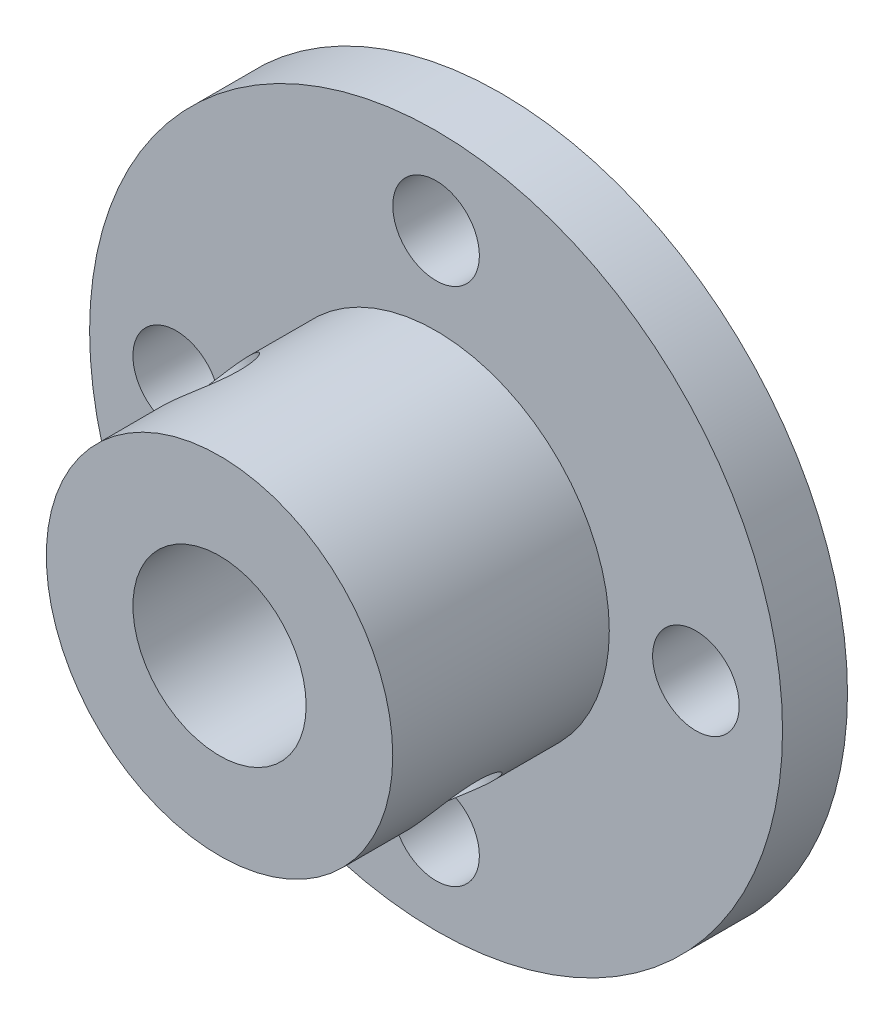
ISO-10303-21;
HEADER;
FILE_DESCRIPTION(('STEP AP214'),'2;1');
FILE_NAME('part.step','',(''),(''),'','','');
FILE_SCHEMA(('AUTOMOTIVE_DESIGN { 1 0 10303 214 1 1 1 1 }'));
ENDSEC;
DATA;
#1=APPLICATION_CONTEXT('core data for automotive mechanical design processes');
#2=APPLICATION_PROTOCOL_DEFINITION('international standard','automotive_design',2000,#1);
#3=PRODUCT_CONTEXT('',#1,'mechanical');
#4=PRODUCT('Part','Part','',(#3));
#5=PRODUCT_RELATED_PRODUCT_CATEGORY('part','',(#4));
#6=PRODUCT_DEFINITION_FORMATION('','',#4);
#7=PRODUCT_DEFINITION_CONTEXT('part definition',#1,'design');
#8=PRODUCT_DEFINITION('design','',#6,#7);
#9=PRODUCT_DEFINITION_SHAPE('','',#8);
#10=(LENGTH_UNIT() NAMED_UNIT(*) SI_UNIT(.MILLI.,.METRE.));
#11=(NAMED_UNIT(*) PLANE_ANGLE_UNIT() SI_UNIT($,.RADIAN.));
#12=(NAMED_UNIT(*) SI_UNIT($,.STERADIAN.) SOLID_ANGLE_UNIT());
#13=UNCERTAINTY_MEASURE_WITH_UNIT(LENGTH_MEASURE(1.E-05),#10,'distance_accuracy_value','');
#14=(GEOMETRIC_REPRESENTATION_CONTEXT(3) GLOBAL_UNCERTAINTY_ASSIGNED_CONTEXT((#13)) GLOBAL_UNIT_ASSIGNED_CONTEXT((#10,
#11,#12)) REPRESENTATION_CONTEXT('',''));
#15=CARTESIAN_POINT('',(0.,0.,0.));
#16=DIRECTION('',(0.,0.,1.));
#17=DIRECTION('',(1.,0.,0.));
#18=AXIS2_PLACEMENT_3D('',#15,#16,#17);
#19=CARTESIAN_POINT('',(0.,0.,3.));
#20=DIRECTION('',(0.,0.,-1.));
#21=DIRECTION('',(-1.,0.,0.));
#22=AXIS2_PLACEMENT_3D('',#19,#20,#21);
#23=CYLINDRICAL_SURFACE('',#22,16.);
#24=CARTESIAN_POINT('',(0.,0.,3.));
#25=DIRECTION('',(0.,0.,1.));
#26=DIRECTION('',(1.,0.,0.));
#27=AXIS2_PLACEMENT_3D('',#24,#25,#26);
#28=CIRCLE('',#27,16.);
#29=CARTESIAN_POINT('',(16.,0.,3.));
#30=VERTEX_POINT('',#29);
#31=EDGE_CURVE('E46',#30,#30,#28,.T.);
#32=ORIENTED_EDGE('',*,*,#31,.F.);
#33=EDGE_LOOP('',(#32));
#34=FACE_BOUND('',#33,.T.);
#35=CARTESIAN_POINT('',(0.,0.,0.));
#36=DIRECTION('',(0.,0.,1.));
#37=DIRECTION('',(1.,0.,0.));
#38=AXIS2_PLACEMENT_3D('',#35,#36,#37);
#39=CIRCLE('',#38,16.);
#40=CARTESIAN_POINT('',(16.,0.,0.));
#41=VERTEX_POINT('',#40);
#42=EDGE_CURVE('E51',#41,#41,#39,.T.);
#43=ORIENTED_EDGE('',*,*,#42,.T.);
#44=EDGE_LOOP('',(#43));
#45=FACE_BOUND('',#44,.T.);
#46=ADVANCED_FACE('F34',(#34,#45),#23,.T.);
#47=CARTESIAN_POINT('',(0.,0.,3.));
#48=DIRECTION('',(0.,0.,1.));
#49=DIRECTION('',(1.,0.,0.));
#50=AXIS2_PLACEMENT_3D('',#47,#48,#49);
#51=PLANE('',#50);
#52=CARTESIAN_POINT('',(-12.,0.,3.));
#53=DIRECTION('',(0.,0.,1.));
#54=DIRECTION('',(1.,0.,0.));
#55=AXIS2_PLACEMENT_3D('',#52,#53,#54);
#56=CIRCLE('',#55,2.);
#57=CARTESIAN_POINT('',(-10.,0.,3.));
#58=VERTEX_POINT('',#57);
#59=EDGE_CURVE('E92',#58,#58,#56,.T.);
#60=ORIENTED_EDGE('',*,*,#59,.F.);
#61=EDGE_LOOP('',(#60));
#62=FACE_BOUND('',#61,.T.);
#63=CARTESIAN_POINT('',(0.,12.,3.));
#64=DIRECTION('',(0.,0.,1.));
#65=DIRECTION('',(1.,0.,0.));
#66=AXIS2_PLACEMENT_3D('',#63,#64,#65);
#67=CIRCLE('',#66,2.);
#68=CARTESIAN_POINT('',(2.00000000000004,12.,3.));
#69=VERTEX_POINT('',#68);
#70=EDGE_CURVE('E100',#69,#69,#67,.T.);
#71=ORIENTED_EDGE('',*,*,#70,.F.);
#72=EDGE_LOOP('',(#71));
#73=FACE_BOUND('',#72,.T.);
#74=CARTESIAN_POINT('',(12.,0.,3.));
#75=DIRECTION('',(0.,0.,1.));
#76=DIRECTION('',(1.,0.,0.));
#77=AXIS2_PLACEMENT_3D('',#74,#75,#76);
#78=CIRCLE('',#77,2.);
#79=CARTESIAN_POINT('',(14.,0.,3.));
#80=VERTEX_POINT('',#79);
#81=EDGE_CURVE('E106',#80,#80,#78,.T.);
#82=ORIENTED_EDGE('',*,*,#81,.F.);
#83=EDGE_LOOP('',(#82));
#84=FACE_BOUND('',#83,.T.);
#85=CARTESIAN_POINT('',(-1.25693328198353E-13,-12.,3.));
#86=DIRECTION('',(0.,0.,1.));
#87=DIRECTION('',(1.,0.,0.));
#88=AXIS2_PLACEMENT_3D('',#85,#86,#87);
#89=CIRCLE('',#88,2.);
#90=CARTESIAN_POINT('',(1.99999999999987,-12.,3.));
#91=VERTEX_POINT('',#90);
#92=EDGE_CURVE('E112',#91,#91,#89,.T.);
#93=ORIENTED_EDGE('',*,*,#92,.F.);
#94=EDGE_LOOP('',(#93));
#95=FACE_BOUND('',#94,.T.);
#96=CARTESIAN_POINT('',(0.,0.,3.));
#97=DIRECTION('',(0.,0.,1.));
#98=DIRECTION('',(1.,0.,0.));
#99=AXIS2_PLACEMENT_3D('',#96,#97,#98);
#100=CIRCLE('',#99,8.);
#101=CARTESIAN_POINT('',(8.,0.,3.));
#102=VERTEX_POINT('',#101);
#103=EDGE_CURVE('E10',#102,#102,#100,.T.);
#104=ORIENTED_EDGE('',*,*,#103,.F.);
#105=EDGE_LOOP('',(#104));
#106=FACE_BOUND('',#105,.T.);
#107=ORIENTED_EDGE('',*,*,#31,.T.);
#108=EDGE_LOOP('',(#107));
#109=FACE_BOUND('',#108,.T.);
#110=ADVANCED_FACE('F137',(#62,#73,#84,#95,#106,#109),#51,.T.);
#111=CARTESIAN_POINT('',(0.,0.,0.));
#112=DIRECTION('',(0.,0.,1.));
#113=DIRECTION('',(1.,0.,0.));
#114=AXIS2_PLACEMENT_3D('',#111,#112,#113);
#115=PLANE('',#114);
#116=CARTESIAN_POINT('',(-12.,0.,0.));
#117=DIRECTION('',(0.,0.,1.));
#118=DIRECTION('',(1.,0.,0.));
#119=AXIS2_PLACEMENT_3D('',#116,#117,#118);
#120=CIRCLE('',#119,2.);
#121=CARTESIAN_POINT('',(-10.,0.,0.));
#122=VERTEX_POINT('',#121);
#123=EDGE_CURVE('E95',#122,#122,#120,.F.);
#124=ORIENTED_EDGE('',*,*,#123,.F.);
#125=EDGE_LOOP('',(#124));
#126=FACE_BOUND('',#125,.T.);
#127=CARTESIAN_POINT('',(0.,12.,0.));
#128=DIRECTION('',(0.,0.,1.));
#129=DIRECTION('',(1.,0.,0.));
#130=AXIS2_PLACEMENT_3D('',#127,#128,#129);
#131=CIRCLE('',#130,2.);
#132=CARTESIAN_POINT('',(2.00000000000004,12.,0.));
#133=VERTEX_POINT('',#132);
#134=EDGE_CURVE('E96',#133,#133,#131,.F.);
#135=ORIENTED_EDGE('',*,*,#134,.F.);
#136=EDGE_LOOP('',(#135));
#137=FACE_BOUND('',#136,.T.);
#138=CARTESIAN_POINT('',(12.,0.,0.));
#139=DIRECTION('',(0.,0.,1.));
#140=DIRECTION('',(1.,0.,0.));
#141=AXIS2_PLACEMENT_3D('',#138,#139,#140);
#142=CIRCLE('',#141,2.);
#143=CARTESIAN_POINT('',(14.,0.,0.));
#144=VERTEX_POINT('',#143);
#145=EDGE_CURVE('E103',#144,#144,#142,.F.);
#146=ORIENTED_EDGE('',*,*,#145,.F.);
#147=EDGE_LOOP('',(#146));
#148=FACE_BOUND('',#147,.T.);
#149=CARTESIAN_POINT('',(-1.25693328198353E-13,-12.,0.));
#150=DIRECTION('',(0.,0.,1.));
#151=DIRECTION('',(1.,0.,0.));
#152=AXIS2_PLACEMENT_3D('',#149,#150,#151);
#153=CIRCLE('',#152,2.);
#154=CARTESIAN_POINT('',(1.99999999999987,-12.,0.));
#155=VERTEX_POINT('',#154);
#156=EDGE_CURVE('E109',#155,#155,#153,.F.);
#157=ORIENTED_EDGE('',*,*,#156,.F.);
#158=EDGE_LOOP('',(#157));
#159=FACE_BOUND('',#158,.T.);
#160=CARTESIAN_POINT('',(0.,0.,0.));
#161=DIRECTION('',(0.,0.,1.));
#162=DIRECTION('',(1.,0.,0.));
#163=AXIS2_PLACEMENT_3D('',#160,#161,#162);
#164=CIRCLE('',#163,4.);
#165=CARTESIAN_POINT('',(4.,0.,0.));
#166=VERTEX_POINT('',#165);
#167=EDGE_CURVE('E118',#166,#166,#164,.F.);
#168=ORIENTED_EDGE('',*,*,#167,.F.);
#169=EDGE_LOOP('',(#168));
#170=FACE_BOUND('',#169,.T.);
#171=ORIENTED_EDGE('',*,*,#42,.F.);
#172=EDGE_LOOP('',(#171));
#173=FACE_BOUND('',#172,.T.);
#174=ADVANCED_FACE('F129',(#126,#137,#148,#159,#170,#173),#115,.F.);
#175=CARTESIAN_POINT('',(0.,0.,13.));
#176=DIRECTION('',(0.,0.,-1.));
#177=DIRECTION('',(-1.,0.,0.));
#178=AXIS2_PLACEMENT_3D('',#175,#176,#177);
#179=CYLINDRICAL_SURFACE('',#178,8.);
#180=CARTESIAN_POINT('',(-4.06301201267858,6.89143913742475,8.));
#181=CARTESIAN_POINT('',(-4.0630157217461,6.89143840992678,7.88955939925874));
#182=CARTESIAN_POINT('',(-4.07119094661866,6.88663699998199,7.77908408105718));
#183=CARTESIAN_POINT('',(-4.10347952386452,6.8674446736421,7.56130593746119));
#184=CARTESIAN_POINT('',(-4.12760215209942,6.85304817619185,7.45400499642545));
#185=CARTESIAN_POINT('',(-4.19053882294768,6.81474355280739,7.24575716945025));
#186=CARTESIAN_POINT('',(-4.22933389862524,6.79084770456586,7.14480227569143));
#187=CARTESIAN_POINT('',(-4.31983456089164,6.73363818775688,6.95175131796809));
#188=CARTESIAN_POINT('',(-4.37154069559713,6.70032411934725,6.85965563033583));
#189=CARTESIAN_POINT('',(-4.48684637018174,6.62367602879998,6.68491068379023));
#190=CARTESIAN_POINT('',(-4.55066154225101,6.58015630647196,6.60248511971996));
#191=CARTESIAN_POINT('',(-4.68695643232218,6.48377932397724,6.45139088451173));
#192=CARTESIAN_POINT('',(-4.75943695936014,6.4309211917146,6.3827234995026));
#193=CARTESIAN_POINT('',(-4.9114273459846,6.31562284697669,6.26017962589498));
#194=CARTESIAN_POINT('',(-4.99102117674822,6.25305922347521,6.20652288947083));
#195=CARTESIAN_POINT('',(-5.15341964034351,6.11990810519378,6.11695228467753));
#196=CARTESIAN_POINT('',(-5.23622379749715,6.0493217961739,6.08103579846759));
#197=CARTESIAN_POINT('',(-5.40042272750264,5.90315727405414,6.02868173233713));
#198=CARTESIAN_POINT('',(-5.48181206953389,5.82770915629176,6.01186428453873));
#199=CARTESIAN_POINT('',(-5.64220702569044,5.67256036974151,5.99699329657956));
#200=CARTESIAN_POINT('',(-5.72121299050981,5.59286033141329,5.99893698223232));
#201=CARTESIAN_POINT('',(-5.87281120401386,5.43340869422118,6.02125988020011));
#202=CARTESIAN_POINT('',(-5.94550686942917,5.35369748174385,6.04122906004308));
#203=CARTESIAN_POINT('',(-6.08465610567809,5.19500759492307,6.0983770160388));
#204=CARTESIAN_POINT('',(-6.15110934400265,5.1160289598028,6.13555670830193));
#205=CARTESIAN_POINT('',(-6.27706714233083,4.96069819810759,6.22640205654965));
#206=CARTESIAN_POINT('',(-6.33650349248265,4.88437625109203,6.2802136357294));
#207=CARTESIAN_POINT('',(-6.44688377889625,4.7377342178455,6.40268454329301));
#208=CARTESIAN_POINT('',(-6.49782623493653,4.66741517877446,6.4713464548485));
#209=CARTESIAN_POINT('',(-6.59197311379387,4.53351729227357,6.6237669935859));
#210=CARTESIAN_POINT('',(-6.63493079405378,4.47017237442468,6.70788391387822));
#211=CARTESIAN_POINT('',(-6.7110607284332,4.3550477523866,6.8876799788322));
#212=CARTESIAN_POINT('',(-6.74423252520298,4.30326858875801,6.9833596635928));
#213=CARTESIAN_POINT('',(-6.80076933823172,4.21335778070836,7.18423202731917));
#214=CARTESIAN_POINT('',(-6.82408602244809,4.17529352918692,7.28946858425056));
#215=CARTESIAN_POINT('',(-6.86057652149195,4.11506298248301,7.50606837446116));
#216=CARTESIAN_POINT('',(-6.873752506853,4.09289328527092,7.61743029118651));
#217=CARTESIAN_POINT('',(-6.88969956057794,4.06599066107949,7.8399676012185));
#218=CARTESIAN_POINT('',(-6.89273625372944,4.06081265687819,7.9510702346637));
#219=CARTESIAN_POINT('',(-6.88913796294824,4.06691415530246,8.17265754926253));
#220=CARTESIAN_POINT('',(-6.88250386932815,4.0781921429555,8.28314228636099));
#221=CARTESIAN_POINT('',(-6.85978220326759,4.11629222019197,8.49849141196377));
#222=CARTESIAN_POINT('',(-6.84385108021401,4.14285696526499,8.60341818125668));
#223=CARTESIAN_POINT('',(-6.80272093796124,4.21005104125881,8.80674516628135));
#224=CARTESIAN_POINT('',(-6.77752082088313,4.25068203824292,8.90514460724427));
#225=CARTESIAN_POINT('',(-6.71736283956605,4.34513762694045,9.09475302229388));
#226=CARTESIAN_POINT('',(-6.68222325351208,4.39920540384642,9.18578307203448));
#227=CARTESIAN_POINT('',(-6.60257934082749,4.51785801571828,9.35615069024108));
#228=CARTESIAN_POINT('',(-6.55807347503847,4.58244457883878,9.43548633332006));
#229=CARTESIAN_POINT('',(-6.45878734955348,4.72139000779986,9.58224883405677));
#230=CARTESIAN_POINT('',(-6.40377787521787,4.79595295356256,9.64932805003905));
#231=CARTESIAN_POINT('',(-6.28489454123505,4.95071787868586,9.76714869356099));
#232=CARTESIAN_POINT('',(-6.22102114420669,5.03091956364613,9.81789097328656));
#233=CARTESIAN_POINT('',(-6.08598132443737,5.193447947225,9.90115682762235));
#234=CARTESIAN_POINT('',(-6.0148718896184,5.27575472095148,9.93381142750325));
#235=CARTESIAN_POINT('',(-5.86656929939353,5.44018458825881,9.98036826768673));
#236=CARTESIAN_POINT('',(-5.78937732112478,5.5223077142323,9.99427412699123));
#237=CARTESIAN_POINT('',(-5.6331777231166,5.68149723269519,10.0027351791511));
#238=CARTESIAN_POINT('',(-5.55427562898415,5.75864031304154,9.99780341819082));
#239=CARTESIAN_POINT('',(-5.39507125325284,5.90805599965961,9.9699043454113));
#240=CARTESIAN_POINT('',(-5.31476901336534,5.98032875071098,9.94693756997366));
#241=CARTESIAN_POINT('',(-5.15577475692788,6.11792374119854,9.88389556045828));
#242=CARTESIAN_POINT('',(-5.07707639915272,6.18328130338111,9.84391309337124));
#243=CARTESIAN_POINT('',(-4.92343720739472,6.3063034619686,9.74805884196086));
#244=CARTESIAN_POINT('',(-4.84849684848019,6.36396708726517,9.69218505465903));
#245=CARTESIAN_POINT('',(-4.70320842178743,6.47211220000846,9.56456953200773));
#246=CARTESIAN_POINT('',(-4.63301338394892,6.52238852804643,9.49247971419234));
#247=CARTESIAN_POINT('',(-4.50185397028259,6.61360014536707,9.3351542960453));
#248=CARTESIAN_POINT('',(-4.4408919390182,6.65453306338498,9.24991536777767));
#249=CARTESIAN_POINT('',(-4.32963282694855,6.72746593795125,9.06679717162108));
#250=CARTESIAN_POINT('',(-4.27955592822716,6.75928499530021,8.96871175326949));
#251=CARTESIAN_POINT('',(-4.19386822084579,6.81278497068017,8.76388902025036));
#252=CARTESIAN_POINT('',(-4.1582468883215,6.83447326579849,8.65715806781231));
#253=CARTESIAN_POINT('',(-4.10842695365124,6.86451006442521,8.45884597632968));
#254=CARTESIAN_POINT('',(-4.09145200755028,6.87460498183148,8.36821367122772));
#255=CARTESIAN_POINT('',(-4.06874346251733,6.888069536294,8.18506226200462));
#256=CARTESIAN_POINT('',(-4.06300890467828,6.89143974702916,8.0925433195112));
#257=CARTESIAN_POINT('',(-4.06301201267858,6.89143913742475,8.));
#258=B_SPLINE_CURVE_WITH_KNOTS('',3,(#180,#181,#182,#183,#184,#185,#186,#187,#188,#189,#190,
#191,#192,#193,#194,#195,#196,#197,#198,#199,#200,#201,#202,#203,#204,#205,#206,#207,#208,#209,
#210,#211,#212,#213,#214,#215,#216,#217,#218,#219,#220,#221,#222,#223,#224,#225,#226,#227,#228,
#229,#230,#231,#232,#233,#234,#235,#236,#237,#238,#239,#240,#241,#242,#243,#244,#245,#246,#247,
#248,#249,#250,#251,#252,#253,#254,#255,#256,#257),.UNSPECIFIED.,.T.,.F.,(4,2,2,2,2,2,2,2,2,2,2,
2,2,2,2,2,2,2,2,2,2,2,2,2,2,2,2,2,2,2,2,2,2,2,2,2,2,2,4),(0.,0.330981953388909,
0.662156593142933,0.992904581732818,1.32366661404383,1.66099163354381,1.99834817183893,
2.34041197118336,2.68242527877674,3.01751000796277,3.35254518932817,3.68014610151158,
4.00776445379829,4.33834299403556,4.66897908375131,5.00856373257529,5.34816424959842,
5.68941145606722,6.03058560103638,6.36274859809374,6.69488101747042,7.02157924007366,
7.34831617137134,7.68146276687326,8.01466415108036,8.35620264772255,8.69772332575643,
9.03673658245543,9.37568439127231,9.70546756901965,10.0352409390158,10.3632390124777,
10.6912784459046,11.0271767726566,11.3631602525241,11.7054118182895,12.0474137709606,
12.3247826174462,12.6021278008238),.UNSPECIFIED.);
#259=CARTESIAN_POINT('',(-4.06301201267858,6.89143913742475,8.));
#260=VERTEX_POINT('',#259);
#261=EDGE_CURVE('E63',#260,#260,#258,.T.);
#262=ORIENTED_EDGE('',*,*,#261,.F.);
#263=EDGE_LOOP('',(#262));
#264=FACE_BOUND('',#263,.T.);
#265=CARTESIAN_POINT('',(4.06301201267858,-6.89143913742475,8.));
#266=CARTESIAN_POINT('',(4.0630157217461,-6.89143840992678,8.11044060074126));
#267=CARTESIAN_POINT('',(4.07119094661866,-6.88663699998199,8.22091591894282));
#268=CARTESIAN_POINT('',(4.10347952386452,-6.8674446736421,8.43869406253881));
#269=CARTESIAN_POINT('',(4.12760215209942,-6.85304817619185,8.54599500357455));
#270=CARTESIAN_POINT('',(4.19053882294767,-6.81474355280739,8.75424283054974));
#271=CARTESIAN_POINT('',(4.22933389862524,-6.79084770456586,8.85519772430857));
#272=CARTESIAN_POINT('',(4.31983456089164,-6.73363818775688,9.04824868203191));
#273=CARTESIAN_POINT('',(4.37154069559713,-6.70032411934725,9.14034436966417));
#274=CARTESIAN_POINT('',(4.48684637018174,-6.62367602879998,9.31508931620977));
#275=CARTESIAN_POINT('',(4.55066154225101,-6.58015630647196,9.39751488028004));
#276=CARTESIAN_POINT('',(4.68695643232217,-6.48377932397724,9.54860911548827));
#277=CARTESIAN_POINT('',(4.75943695936014,-6.4309211917146,9.6172765004974));
#278=CARTESIAN_POINT('',(4.9114273459846,-6.31562284697669,9.73982037410502));
#279=CARTESIAN_POINT('',(4.99102117674822,-6.25305922347522,9.79347711052917));
#280=CARTESIAN_POINT('',(5.15341964034351,-6.11990810519378,9.88304771532247));
#281=CARTESIAN_POINT('',(5.23622379749715,-6.0493217961739,9.91896420153241));
#282=CARTESIAN_POINT('',(5.40042272750263,-5.90315727405414,9.97131826766287));
#283=CARTESIAN_POINT('',(5.48181206953389,-5.82770915629176,9.98813571546127));
#284=CARTESIAN_POINT('',(5.64220702569044,-5.67256036974151,10.0030067034204));
#285=CARTESIAN_POINT('',(5.72121299050981,-5.59286033141329,10.0010630177677));
#286=CARTESIAN_POINT('',(5.87281120401386,-5.43340869422118,9.97874011979989));
#287=CARTESIAN_POINT('',(5.94550686942917,-5.35369748174385,9.95877093995692));
#288=CARTESIAN_POINT('',(6.08465610567809,-5.19500759492307,9.9016229839612));
#289=CARTESIAN_POINT('',(6.15110934400265,-5.1160289598028,9.86444329169807));
#290=CARTESIAN_POINT('',(6.27706714233083,-4.96069819810759,9.77359794345035));
#291=CARTESIAN_POINT('',(6.33650349248265,-4.88437625109203,9.7197863642706));
#292=CARTESIAN_POINT('',(6.44688377889625,-4.7377342178455,9.597315456707));
#293=CARTESIAN_POINT('',(6.49782623493653,-4.66741517877446,9.5286535451515));
#294=CARTESIAN_POINT('',(6.59197311379387,-4.53351729227357,9.3762330064141));
#295=CARTESIAN_POINT('',(6.63493079405379,-4.47017237442468,9.29211608612178));
#296=CARTESIAN_POINT('',(6.7110607284332,-4.3550477523866,9.1123200211678));
#297=CARTESIAN_POINT('',(6.74423252520298,-4.30326858875801,9.0166403364072));
#298=CARTESIAN_POINT('',(6.80076933823172,-4.21335778070836,8.81576797268083));
#299=CARTESIAN_POINT('',(6.82408602244809,-4.17529352918692,8.71053141574945));
#300=CARTESIAN_POINT('',(6.86057652149195,-4.11506298248301,8.49393162553884));
#301=CARTESIAN_POINT('',(6.873752506853,-4.09289328527092,8.38256970881349));
#302=CARTESIAN_POINT('',(6.88969956057794,-4.0659906610795,8.1600323987815));
#303=CARTESIAN_POINT('',(6.89273625372944,-4.06081265687819,8.0489297653363));
#304=CARTESIAN_POINT('',(6.88913796294824,-4.06691415530246,7.82734245073747));
#305=CARTESIAN_POINT('',(6.88250386932815,-4.0781921429555,7.71685771363901));
#306=CARTESIAN_POINT('',(6.85978220326759,-4.11629222019197,7.50150858803624));
#307=CARTESIAN_POINT('',(6.84385108021401,-4.14285696526499,7.39658181874332));
#308=CARTESIAN_POINT('',(6.80272093796124,-4.21005104125881,7.19325483371865));
#309=CARTESIAN_POINT('',(6.77752082088313,-4.25068203824292,7.09485539275573));
#310=CARTESIAN_POINT('',(6.71736283956605,-4.34513762694046,6.90524697770612));
#311=CARTESIAN_POINT('',(6.68222325351208,-4.39920540384642,6.81421692796552));
#312=CARTESIAN_POINT('',(6.60257934082749,-4.51785801571828,6.64384930975892));
#313=CARTESIAN_POINT('',(6.55807347503847,-4.58244457883878,6.56451366667994));
#314=CARTESIAN_POINT('',(6.45878734955348,-4.72139000779986,6.41775116594324));
#315=CARTESIAN_POINT('',(6.40377787521787,-4.79595295356256,6.35067194996095));
#316=CARTESIAN_POINT('',(6.28489454123505,-4.95071787868586,6.23285130643901));
#317=CARTESIAN_POINT('',(6.22102114420669,-5.03091956364613,6.18210902671344));
#318=CARTESIAN_POINT('',(6.08598132443737,-5.193447947225,6.09884317237765));
#319=CARTESIAN_POINT('',(6.0148718896184,-5.27575472095148,6.06618857249675));
#320=CARTESIAN_POINT('',(5.86656929939353,-5.44018458825881,6.01963173231327));
#321=CARTESIAN_POINT('',(5.78937732112478,-5.5223077142323,6.00572587300877));
#322=CARTESIAN_POINT('',(5.6331777231166,-5.68149723269519,5.99726482084892));
#323=CARTESIAN_POINT('',(5.55427562898415,-5.75864031304154,6.00219658180918));
#324=CARTESIAN_POINT('',(5.39507125325284,-5.90805599965961,6.0300956545887));
#325=CARTESIAN_POINT('',(5.31476901336534,-5.98032875071099,6.05306243002634));
#326=CARTESIAN_POINT('',(5.15577475692787,-6.11792374119854,6.11610443954172));
#327=CARTESIAN_POINT('',(5.07707639915272,-6.18328130338111,6.15608690662876));
#328=CARTESIAN_POINT('',(4.92343720739472,-6.3063034619686,6.25194115803914));
#329=CARTESIAN_POINT('',(4.84849684848019,-6.36396708726517,6.30781494534097));
#330=CARTESIAN_POINT('',(4.70320842178744,-6.47211220000846,6.43543046799227));
#331=CARTESIAN_POINT('',(4.63301338394892,-6.52238852804643,6.50752028580766));
#332=CARTESIAN_POINT('',(4.50185397028259,-6.61360014536707,6.66484570395469));
#333=CARTESIAN_POINT('',(4.44089193901819,-6.65453306338498,6.75008463222233));
#334=CARTESIAN_POINT('',(4.32963282694855,-6.72746593795126,6.93320282837892));
#335=CARTESIAN_POINT('',(4.27955592822716,-6.75928499530021,7.03128824673051));
#336=CARTESIAN_POINT('',(4.19386822084579,-6.81278497068017,7.23611097974964));
#337=CARTESIAN_POINT('',(4.1582468883215,-6.8344732657985,7.34284193218769));
#338=CARTESIAN_POINT('',(4.10842695365124,-6.86451006442521,7.54115402367032));
#339=CARTESIAN_POINT('',(4.09145200755028,-6.87460498183148,7.63178632877227));
#340=CARTESIAN_POINT('',(4.06874346251733,-6.888069536294,7.81493773799538));
#341=CARTESIAN_POINT('',(4.06300890467828,-6.89143974702916,7.9074566804888));
#342=CARTESIAN_POINT('',(4.06301201267858,-6.89143913742475,8.));
#343=B_SPLINE_CURVE_WITH_KNOTS('',3,(#265,#266,#267,#268,#269,#270,#271,#272,#273,#274,#275,
#276,#277,#278,#279,#280,#281,#282,#283,#284,#285,#286,#287,#288,#289,#290,#291,#292,#293,#294,
#295,#296,#297,#298,#299,#300,#301,#302,#303,#304,#305,#306,#307,#308,#309,#310,#311,#312,#313,
#314,#315,#316,#317,#318,#319,#320,#321,#322,#323,#324,#325,#326,#327,#328,#329,#330,#331,#332,
#333,#334,#335,#336,#337,#338,#339,#340,#341,#342),.UNSPECIFIED.,.T.,.F.,(4,2,2,2,2,2,2,2,2,2,2,
2,2,2,2,2,2,2,2,2,2,2,2,2,2,2,2,2,2,2,2,2,2,2,2,2,2,2,4),(0.,0.330981953388908,
0.662156593142932,0.992904581732815,1.32366661404383,1.66099163354381,1.99834817183893,
2.34041197118336,2.68242527877674,3.01751000796277,3.35254518932816,3.68014610151158,
4.00776445379829,4.33834299403556,4.66897908375131,5.00856373257529,5.34816424959841,
5.68941145606722,6.03058560103638,6.36274859809374,6.69488101747042,7.02157924007366,
7.34831617137134,7.68146276687326,8.01466415108036,8.35620264772255,8.69772332575643,
9.03673658245543,9.37568439127231,9.70546756901965,10.0352409390158,10.3632390124777,
10.6912784459046,11.0271767726566,11.3631602525241,11.7054118182895,12.0474137709606,
12.3247826174462,12.6021278008238),.UNSPECIFIED.);
#344=CARTESIAN_POINT('',(4.06301201267858,-6.89143913742475,8.));
#345=VERTEX_POINT('',#344);
#346=EDGE_CURVE('E88',#345,#345,#343,.T.);
#347=ORIENTED_EDGE('',*,*,#346,.T.);
#348=EDGE_LOOP('',(#347));
#349=FACE_BOUND('',#348,.T.);
#350=CARTESIAN_POINT('',(0.,0.,13.));
#351=DIRECTION('',(0.,0.,1.));
#352=DIRECTION('',(1.,0.,0.));
#353=AXIS2_PLACEMENT_3D('',#350,#351,#352);
#354=CIRCLE('',#353,8.);
#355=CARTESIAN_POINT('',(8.,0.,13.));
#356=VERTEX_POINT('',#355);
#357=EDGE_CURVE('E54',#356,#356,#354,.T.);
#358=ORIENTED_EDGE('',*,*,#357,.F.);
#359=EDGE_LOOP('',(#358));
#360=FACE_BOUND('',#359,.T.);
#361=ORIENTED_EDGE('',*,*,#103,.T.);
#362=EDGE_LOOP('',(#361));
#363=FACE_BOUND('',#362,.T.);
#364=ADVANCED_FACE('F127',(#264,#349,#360,#363),#179,.T.);
#365=CARTESIAN_POINT('',(0.,0.,13.));
#366=DIRECTION('',(0.,0.,1.));
#367=DIRECTION('',(1.,0.,0.));
#368=AXIS2_PLACEMENT_3D('',#365,#366,#367);
#369=PLANE('',#368);
#370=CARTESIAN_POINT('',(0.,0.,13.));
#371=DIRECTION('',(0.,0.,1.));
#372=DIRECTION('',(1.,0.,0.));
#373=AXIS2_PLACEMENT_3D('',#370,#371,#372);
#374=CIRCLE('',#373,4.);
#375=CARTESIAN_POINT('',(4.,0.,13.));
#376=VERTEX_POINT('',#375);
#377=EDGE_CURVE('E99',#376,#376,#374,.T.);
#378=ORIENTED_EDGE('',*,*,#377,.F.);
#379=EDGE_LOOP('',(#378));
#380=FACE_BOUND('',#379,.T.);
#381=ORIENTED_EDGE('',*,*,#357,.T.);
#382=EDGE_LOOP('',(#381));
#383=FACE_BOUND('',#382,.T.);
#384=ADVANCED_FACE('F125',(#380,#383),#369,.T.);
#385=CARTESIAN_POINT('',(0.,0.,-11.3137084989848));
#386=DIRECTION('',(0.,0.,1.));
#387=DIRECTION('',(1.,0.,0.));
#388=AXIS2_PLACEMENT_3D('',#385,#386,#387);
#389=CYLINDRICAL_SURFACE('',#388,4.);
#390=CARTESIAN_POINT('',(-1.03527618041009,3.86370330515627,8.));
#391=CARTESIAN_POINT('',(-1.03528937115709,3.86370459881444,7.89578679452566));
#392=CARTESIAN_POINT('',(-1.04445095043979,3.86128100934837,7.7914378234662));
#393=CARTESIAN_POINT('',(-1.08031794598724,3.8513940803619,7.5859448227694));
#394=CARTESIAN_POINT('',(-1.1070602266733,3.84392015002066,7.48480799675224));
#395=CARTESIAN_POINT('',(-1.17576810402632,3.82345847525807,7.28909684355307));
#396=CARTESIAN_POINT('',(-1.21765273191303,3.81049999591903,7.19449074115075));
#397=CARTESIAN_POINT('',(-1.31402940114761,3.77834613351913,7.01315154952385));
#398=CARTESIAN_POINT('',(-1.36852212452518,3.75915041303457,6.92641888656322));
#399=CARTESIAN_POINT('',(-1.49242262258696,3.71179474047926,6.75538855686661));
#400=CARTESIAN_POINT('',(-1.56268986729791,3.68302601797015,6.67188173240823));
#401=CARTESIAN_POINT('',(-1.71185746004076,3.6161067938154,6.5171832194294));
#402=CARTESIAN_POINT('',(-1.79076208249943,3.57795163529628,6.44599767379603));
#403=CARTESIAN_POINT('',(-1.9597113809695,3.48844672204306,6.3132656988115));
#404=CARTESIAN_POINT('',(-2.05014845548512,3.43638092272622,6.25269246457669));
#405=CARTESIAN_POINT('',(-2.23353894528091,3.32009909967181,6.14971829321291));
#406=CARTESIAN_POINT('',(-2.32649073298615,3.25589078089575,6.1073058876492));
#407=CARTESIAN_POINT('',(-2.50423233896791,3.12095657273504,6.04499067746882));
#408=CARTESIAN_POINT('',(-2.58913230708547,3.05101952081114,6.0237009473079));
#409=CARTESIAN_POINT('',(-2.75418828042584,2.90288047261229,5.99966776263097));
#410=CARTESIAN_POINT('',(-2.83434712692784,2.82468350628804,5.99691308640371));
#411=CARTESIAN_POINT('',(-2.98040182849615,2.66974853723372,6.00949334794514));
#412=CARTESIAN_POINT('',(-3.04693182899993,2.59347500057565,6.02327603104364));
#413=CARTESIAN_POINT('',(-3.17216053387482,2.43871042756156,6.06576168780812));
#414=CARTESIAN_POINT('',(-3.2308586518208,2.3602192256868,6.09446577795212));
#415=CARTESIAN_POINT('',(-3.34040810707925,2.20250531142357,6.16616513217995));
#416=CARTESIAN_POINT('',(-3.3911396448263,2.12328750299556,6.20935262634422));
#417=CARTESIAN_POINT('',(-3.48370759115982,1.96773626752486,6.3085268324029));
#418=CARTESIAN_POINT('',(-3.52554080478518,1.89140388456175,6.36451812660467));
#419=CARTESIAN_POINT('',(-3.60428958213898,1.7370364926115,6.49379070306606));
#420=CARTESIAN_POINT('',(-3.64036649555481,1.65952260135772,6.56820605665203));
#421=CARTESIAN_POINT('',(-3.70332720013195,1.51382940179714,6.72917944986035));
#422=CARTESIAN_POINT('',(-3.73020393016802,1.4456572872441,6.81574674454812));
#423=CARTESIAN_POINT('',(-3.77728932408925,1.3179568504757,7.00529638484818));
#424=CARTESIAN_POINT('',(-3.79696615323056,1.25925236275468,7.10897204610842));
#425=CARTESIAN_POINT('',(-3.82838022178834,1.16027085528413,7.325875342718));
#426=CARTESIAN_POINT('',(-3.84012575033586,1.11997461107766,7.43909286603513));
#427=CARTESIAN_POINT('',(-3.85603227368294,1.06386498780703,7.66242902256558));
#428=CARTESIAN_POINT('',(-3.86072054919911,1.04636450399107,7.7720822380871));
#429=CARTESIAN_POINT('',(-3.86461594335437,1.03189824566562,7.99280268303309));
#430=CARTESIAN_POINT('',(-3.86382693378153,1.03491796578461,8.1038688582396));
#431=CARTESIAN_POINT('',(-3.8570969495911,1.05968057724537,8.31130783715744));
#432=CARTESIAN_POINT('',(-3.85172899517205,1.07933918703677,8.40795890221578));
#433=CARTESIAN_POINT('',(-3.83624732829456,1.13313003382098,8.59673557254199));
#434=CARTESIAN_POINT('',(-3.82613207885531,1.16726695795744,8.68885970149348));
#435=CARTESIAN_POINT('',(-3.80000571468505,1.24976121811304,8.87082266180511));
#436=CARTESIAN_POINT('',(-3.78374322988911,1.29870394849983,8.96035803370605));
#437=CARTESIAN_POINT('',(-3.74462291896736,1.40753017427794,9.13093854307904));
#438=CARTESIAN_POINT('',(-3.7217617026214,1.46741928775995,9.21197928703051));
#439=CARTESIAN_POINT('',(-3.66524154585663,1.60377873262909,9.37395753504266));
#440=CARTESIAN_POINT('',(-3.63058476054877,1.68138757944598,9.45359430141778));
#441=CARTESIAN_POINT('',(-3.5507322401369,1.84404659815511,9.59882447600473));
#442=CARTESIAN_POINT('',(-3.5055329558257,1.92909927002594,9.66441314052684));
#443=CARTESIAN_POINT('',(-3.40252567713481,2.10559182003165,9.78114745183271));
#444=CARTESIAN_POINT('',(-3.3444163981957,2.19714102664403,9.83186623616677));
#445=CARTESIAN_POINT('',(-3.21642497959979,2.38056150742932,9.91427580796961));
#446=CARTESIAN_POINT('',(-3.14655324686928,2.47243242721346,9.9459833036841));
#447=CARTESIAN_POINT('',(-3.00330136916831,2.64414859154452,9.98673712748514));
#448=CARTESIAN_POINT('',(-2.93083135085755,2.72432380326583,9.99759574866428));
#449=CARTESIAN_POINT('',(-2.77934729282199,2.87869858365822,10.0016865339957));
#450=CARTESIAN_POINT('',(-2.70033555329973,2.95290023480643,9.99492486852887));
#451=CARTESIAN_POINT('',(-2.54388975347637,3.0884694356153,9.9651671756836));
#452=CARTESIAN_POINT('',(-2.46669480823202,3.15036049200075,9.94327026269095));
#453=CARTESIAN_POINT('',(-2.31149669440089,3.26593797100563,9.88534604019333));
#454=CARTESIAN_POINT('',(-2.23349341147187,3.31962321548962,9.84931670429309));
#455=CARTESIAN_POINT('',(-2.07583342321292,3.42053391102493,9.7625457450086));
#456=CARTESIAN_POINT('',(-1.99624869216631,3.46738486763519,9.71124078024814));
#457=CARTESIAN_POINT('',(-1.8414569996925,3.55201788731206,9.59608471188191));
#458=CARTESIAN_POINT('',(-1.76625206959521,3.58979576730867,9.53222784589843));
#459=CARTESIAN_POINT('',(-1.61555786947553,3.66026791477986,9.38640336444059));
#460=CARTESIAN_POINT('',(-1.54078515186373,3.69208209776399,9.30326581919971));
#461=CARTESIAN_POINT('',(-1.40285481283078,3.74666670664265,9.12510777169391));
#462=CARTESIAN_POINT('',(-1.33970747877439,3.7694291430603,9.03007686863948));
#463=CARTESIAN_POINT('',(-1.2269184524633,3.80767032151753,8.82669110586976));
#464=CARTESIAN_POINT('',(-1.17776662816843,3.82289615256722,8.71801008926473));
#465=CARTESIAN_POINT('',(-1.11935207552343,3.84024140403409,8.54942188036906));
#466=CARTESIAN_POINT('',(-1.10244115407729,3.84510564702044,8.49235217940932));
#467=CARTESIAN_POINT('',(-1.0740809843713,3.8531247587118,8.37676744249981));
#468=CARTESIAN_POINT('',(-1.06262791767176,3.85628082270828,8.31825344724575));
#469=CARTESIAN_POINT('',(-1.04783389616825,3.86032188599497,8.21639921075271));
#470=CARTESIAN_POINT('',(-1.04313310007072,3.86159132004935,8.17326694274993));
#471=CARTESIAN_POINT('',(-1.03685139155021,3.86328178867122,8.0867643069071));
#472=CARTESIAN_POINT('',(-1.03527068784068,3.86370276648266,8.0433939233333));
#473=CARTESIAN_POINT('',(-1.03527618041009,3.86370330515627,8.));
#474=B_SPLINE_CURVE_WITH_KNOTS('',3,(#390,#391,#392,#393,#394,#395,#396,#397,#398,#399,#400,
#401,#402,#403,#404,#405,#406,#407,#408,#409,#410,#411,#412,#413,#414,#415,#416,#417,#418,#419,
#420,#421,#422,#423,#424,#425,#426,#427,#428,#429,#430,#431,#432,#433,#434,#435,#436,#437,#438,
#439,#440,#441,#442,#443,#444,#445,#446,#447,#448,#449,#450,#451,#452,#453,#454,#455,#456,#457,
#458,#459,#460,#461,#462,#463,#464,#465,#466,#467,#468,#469,#470,#471,#472,#473),.UNSPECIFIED.,
.T.,.F.,(4,2,2,2,2,2,2,2,2,2,2,2,2,2,2,2,2,2,2,2,2,2,2,2,2,2,2,2,2,2,2,2,2,2,2,2,2,2,2,2,2,4),
(0.,0.312464245189432,0.62558578564961,0.937057191861537,1.24854545093097,1.58572462503713,
1.92307142172809,2.28315784481594,2.64301653931849,2.97726969939937,3.31132047376147,
3.61632194973143,3.92134625038977,4.2305906946636,4.5399459870461,4.87854382917848,
5.21740096495904,5.57777683462963,5.93777548427477,6.2692458171249,6.60048186380813,
6.89548366852117,7.19058104876193,7.49934592816242,7.80826972444162,8.15613487165293,
8.50411729960471,8.86128362829998,9.2181355962161,9.5422454078304,9.8662417359201,
10.1688884974705,10.4715786702809,10.7872150144301,11.1029966020551,11.450204837042,
11.7977188569438,12.1562149808128,12.3351395323571,12.5139387197526,12.6440387634036,
12.7741475095882),.UNSPECIFIED.);
#475=CARTESIAN_POINT('',(-1.03527618041009,3.86370330515627,8.));
#476=VERTEX_POINT('',#475);
#477=EDGE_CURVE('E37',#476,#476,#474,.T.);
#478=ORIENTED_EDGE('',*,*,#477,.T.);
#479=EDGE_LOOP('',(#478));
#480=FACE_BOUND('',#479,.T.);
#481=CARTESIAN_POINT('',(3.86370330515628,-1.03527618041008,8.));
#482=CARTESIAN_POINT('',(3.86370459881445,-1.03528937115708,8.10421320547434));
#483=CARTESIAN_POINT('',(3.86128100934838,-1.04445095043978,8.2085621765338));
#484=CARTESIAN_POINT('',(3.8513940803619,-1.08031794598723,8.4140551772306));
#485=CARTESIAN_POINT('',(3.84392015002067,-1.10706022667329,8.51519200324776));
#486=CARTESIAN_POINT('',(3.82345847525807,-1.17576810402631,8.71090315644693));
#487=CARTESIAN_POINT('',(3.81049999591904,-1.21765273191302,8.80550925884925));
#488=CARTESIAN_POINT('',(3.77834613351914,-1.3140294011476,8.98684845047615));
#489=CARTESIAN_POINT('',(3.75915041303458,-1.36852212452517,9.07358111343677));
#490=CARTESIAN_POINT('',(3.71179474047926,-1.49242262258694,9.24461144313339));
#491=CARTESIAN_POINT('',(3.68302601797015,-1.56268986729789,9.32811826759177));
#492=CARTESIAN_POINT('',(3.61610679381541,-1.71185746004075,9.4828167805706));
#493=CARTESIAN_POINT('',(3.57795163529629,-1.79076208249942,9.55400232620397));
#494=CARTESIAN_POINT('',(3.48844672204306,-1.95971138096948,9.6867343011885));
#495=CARTESIAN_POINT('',(3.43638092272623,-2.05014845548511,9.74730753542331));
#496=CARTESIAN_POINT('',(3.32009909967182,-2.2335389452809,9.85028170678709));
#497=CARTESIAN_POINT('',(3.25589078089575,-2.32649073298614,9.8926941123508));
#498=CARTESIAN_POINT('',(3.12095657273504,-2.5042323389679,9.95500932253118));
#499=CARTESIAN_POINT('',(3.05101952081115,-2.58913230708546,9.9762990526921));
#500=CARTESIAN_POINT('',(2.9028804726123,-2.75418828042583,10.000332237369));
#501=CARTESIAN_POINT('',(2.82468350628805,-2.83434712692783,10.0030869135963));
#502=CARTESIAN_POINT('',(2.66974853723373,-2.98040182849614,9.99050665205486));
#503=CARTESIAN_POINT('',(2.59347500057567,-3.04693182899992,9.97672396895636));
#504=CARTESIAN_POINT('',(2.43871042756158,-3.17216053387481,9.93423831219188));
#505=CARTESIAN_POINT('',(2.36021922568682,-3.23085865182078,9.90553422204787));
#506=CARTESIAN_POINT('',(2.20250531142358,-3.34040810707924,9.83383486782005));
#507=CARTESIAN_POINT('',(2.12328750299557,-3.39113964482629,9.79064737365578));
#508=CARTESIAN_POINT('',(1.96773626752487,-3.48370759115981,9.6914731675971));
#509=CARTESIAN_POINT('',(1.89140388456176,-3.52554080478517,9.63548187339532));
#510=CARTESIAN_POINT('',(1.73703649261152,-3.60428958213898,9.50620929693394));
#511=CARTESIAN_POINT('',(1.65952260135773,-3.64036649555481,9.43179394334797));
#512=CARTESIAN_POINT('',(1.51382940179715,-3.70332720013195,9.27082055013965));
#513=CARTESIAN_POINT('',(1.44565728724411,-3.73020393016802,9.18425325545187));
#514=CARTESIAN_POINT('',(1.31795685047571,-3.77728932408925,8.99470361515182));
#515=CARTESIAN_POINT('',(1.25925236275469,-3.79696615323056,8.89102795389158));
#516=CARTESIAN_POINT('',(1.16027085528414,-3.82838022178833,8.674124657282));
#517=CARTESIAN_POINT('',(1.11997461107767,-3.84012575033585,8.56090713396487));
#518=CARTESIAN_POINT('',(1.06386498780705,-3.85603227368293,8.33757097743442));
#519=CARTESIAN_POINT('',(1.04636450399108,-3.8607205491991,8.2279177619129));
#520=CARTESIAN_POINT('',(1.03189824566563,-3.86461594335437,8.00719731696691));
#521=CARTESIAN_POINT('',(1.03491796578462,-3.86382693378153,7.8961311417604));
#522=CARTESIAN_POINT('',(1.05968057724539,-3.8570969495911,7.68869216284256));
#523=CARTESIAN_POINT('',(1.07933918703678,-3.85172899517205,7.59204109778422));
#524=CARTESIAN_POINT('',(1.133130033821,-3.83624732829456,7.40326442745801));
#525=CARTESIAN_POINT('',(1.16726695795746,-3.82613207885531,7.31114029850652));
#526=CARTESIAN_POINT('',(1.24976121811306,-3.80000571468505,7.12917733819488));
#527=CARTESIAN_POINT('',(1.29870394849984,-3.78374322988911,7.03964196629395));
#528=CARTESIAN_POINT('',(1.40753017427796,-3.74462291896735,6.86906145692096));
#529=CARTESIAN_POINT('',(1.46741928775996,-3.7217617026214,6.78802071296949));
#530=CARTESIAN_POINT('',(1.6037787326291,-3.66524154585663,6.62604246495734));
#531=CARTESIAN_POINT('',(1.68138757944599,-3.63058476054876,6.54640569858222));
#532=CARTESIAN_POINT('',(1.84404659815512,-3.5507322401369,6.40117552399527));
#533=CARTESIAN_POINT('',(1.92909927002595,-3.50553295582569,6.33558685947316));
#534=CARTESIAN_POINT('',(2.10559182003166,-3.4025256771348,6.21885254816729));
#535=CARTESIAN_POINT('',(2.19714102664404,-3.34441639819569,6.16813376383323));
#536=CARTESIAN_POINT('',(2.38056150742933,-3.21642497959978,6.08572419203039));
#537=CARTESIAN_POINT('',(2.47243242721347,-3.14655324686927,6.0540166963159));
#538=CARTESIAN_POINT('',(2.64414859154453,-3.0033013691683,6.01326287251486));
#539=CARTESIAN_POINT('',(2.72432380326584,-2.93083135085754,6.00240425133572));
#540=CARTESIAN_POINT('',(2.87869858365823,-2.77934729282198,5.99831346600433));
#541=CARTESIAN_POINT('',(2.95290023480644,-2.70033555329972,6.00507513147113));
#542=CARTESIAN_POINT('',(3.08846943561531,-2.54388975347636,6.03483282431641));
#543=CARTESIAN_POINT('',(3.15036049200076,-2.466694808232,6.05672973730905));
#544=CARTESIAN_POINT('',(3.26593797100564,-2.31149669440088,6.11465395980667));
#545=CARTESIAN_POINT('',(3.31962321548963,-2.23349341147186,6.15068329570691));
#546=CARTESIAN_POINT('',(3.42053391102494,-2.0758334232129,6.2374542549914));
#547=CARTESIAN_POINT('',(3.4673848676352,-1.9962486921663,6.28875921975186));
#548=CARTESIAN_POINT('',(3.55201788731207,-1.84145699969249,6.4039152881181));
#549=CARTESIAN_POINT('',(3.58979576730868,-1.7662520695952,6.46777215410157));
#550=CARTESIAN_POINT('',(3.66026791477986,-1.61555786947552,6.61359663555941));
#551=CARTESIAN_POINT('',(3.69208209776399,-1.54078515186371,6.69673418080028));
#552=CARTESIAN_POINT('',(3.74666670664265,-1.40285481283077,6.87489222830609));
#553=CARTESIAN_POINT('',(3.76942914306031,-1.33970747877438,6.96992313136052));
#554=CARTESIAN_POINT('',(3.80767032151753,-1.22691845246329,7.17330889413025));
#555=CARTESIAN_POINT('',(3.82289615256722,-1.17776662816842,7.28198991073527));
#556=CARTESIAN_POINT('',(3.84024140403409,-1.11935207552341,7.45057811963095));
#557=CARTESIAN_POINT('',(3.84510564702044,-1.10244115407727,7.50764782059068));
#558=CARTESIAN_POINT('',(3.8531247587118,-1.07408098437129,7.62323255750019));
#559=CARTESIAN_POINT('',(3.85628082270828,-1.06262791767175,7.68174655275425));
#560=CARTESIAN_POINT('',(3.86032188599498,-1.04783389616824,7.78360078924729));
#561=CARTESIAN_POINT('',(3.86159132004936,-1.0431331000707,7.82673305725007));
#562=CARTESIAN_POINT('',(3.86328178867122,-1.03685139155019,7.9132356930929));
#563=CARTESIAN_POINT('',(3.86370276648267,-1.03527068784067,7.9566060766667));
#564=CARTESIAN_POINT('',(3.86370330515628,-1.03527618041008,8.));
#565=B_SPLINE_CURVE_WITH_KNOTS('',3,(#481,#482,#483,#484,#485,#486,#487,#488,#489,#490,#491,
#492,#493,#494,#495,#496,#497,#498,#499,#500,#501,#502,#503,#504,#505,#506,#507,#508,#509,#510,
#511,#512,#513,#514,#515,#516,#517,#518,#519,#520,#521,#522,#523,#524,#525,#526,#527,#528,#529,
#530,#531,#532,#533,#534,#535,#536,#537,#538,#539,#540,#541,#542,#543,#544,#545,#546,#547,#548,
#549,#550,#551,#552,#553,#554,#555,#556,#557,#558,#559,#560,#561,#562,#563,#564),.UNSPECIFIED.,
.T.,.F.,(4,2,2,2,2,2,2,2,2,2,2,2,2,2,2,2,2,2,2,2,2,2,2,2,2,2,2,2,2,2,2,2,2,2,2,2,2,2,2,2,2,4),
(0.,0.312464245189432,0.62558578564961,0.937057191861535,1.24854545093096,1.58572462503713,
1.92307142172808,2.28315784481594,2.64301653931849,2.97726969939937,3.31132047376147,
3.61632194973143,3.92134625038977,4.2305906946636,4.53994598704611,4.87854382917848,
5.21740096495904,5.57777683462964,5.93777548427477,6.2692458171249,6.60048186380813,
6.89548366852118,7.19058104876193,7.49934592816242,7.80826972444161,8.15613487165293,
8.50411729960471,8.86128362829998,9.2181355962161,9.54224540783041,9.8662417359201,
10.1688884974705,10.4715786702809,10.7872150144301,11.102996602055,11.450204837042,
11.7977188569438,12.1562149808128,12.3351395323571,12.5139387197526,12.6440387634036,
12.7741475095882),.UNSPECIFIED.);
#566=CARTESIAN_POINT('',(3.86370330515628,-1.03527618041008,8.));
#567=VERTEX_POINT('',#566);
#568=EDGE_CURVE('E58',#567,#567,#565,.T.);
#569=ORIENTED_EDGE('',*,*,#568,.T.);
#570=EDGE_LOOP('',(#569));
#571=FACE_BOUND('',#570,.T.);
#572=ORIENTED_EDGE('',*,*,#167,.T.);
#573=EDGE_LOOP('',(#572));
#574=FACE_BOUND('',#573,.T.);
#575=ORIENTED_EDGE('',*,*,#377,.T.);
#576=EDGE_LOOP('',(#575));
#577=FACE_BOUND('',#576,.T.);
#578=ADVANCED_FACE('F64',(#480,#571,#574,#577),#389,.F.);
#579=CARTESIAN_POINT('',(-1.25693328198353E-13,-12.,-5.65685424949238));
#580=DIRECTION('',(0.,0.,1.));
#581=DIRECTION('',(1.,0.,0.));
#582=AXIS2_PLACEMENT_3D('',#579,#580,#581);
#583=CYLINDRICAL_SURFACE('',#582,2.);
#584=ORIENTED_EDGE('',*,*,#156,.T.);
#585=EDGE_LOOP('',(#584));
#586=FACE_BOUND('',#585,.T.);
#587=ORIENTED_EDGE('',*,*,#92,.T.);
#588=EDGE_LOOP('',(#587));
#589=FACE_BOUND('',#588,.T.);
#590=ADVANCED_FACE('F164',(#586,#589),#583,.F.);
#591=CARTESIAN_POINT('',(12.,0.,-5.65685424949238));
#592=DIRECTION('',(0.,0.,1.));
#593=DIRECTION('',(1.,0.,0.));
#594=AXIS2_PLACEMENT_3D('',#591,#592,#593);
#595=CYLINDRICAL_SURFACE('',#594,2.);
#596=ORIENTED_EDGE('',*,*,#145,.T.);
#597=EDGE_LOOP('',(#596));
#598=FACE_BOUND('',#597,.T.);
#599=ORIENTED_EDGE('',*,*,#81,.T.);
#600=EDGE_LOOP('',(#599));
#601=FACE_BOUND('',#600,.T.);
#602=ADVANCED_FACE('F166',(#598,#601),#595,.F.);
#603=CARTESIAN_POINT('',(0.,12.,-5.65685424949238));
#604=DIRECTION('',(0.,0.,1.));
#605=DIRECTION('',(1.,0.,0.));
#606=AXIS2_PLACEMENT_3D('',#603,#604,#605);
#607=CYLINDRICAL_SURFACE('',#606,2.);
#608=ORIENTED_EDGE('',*,*,#134,.T.);
#609=EDGE_LOOP('',(#608));
#610=FACE_BOUND('',#609,.T.);
#611=ORIENTED_EDGE('',*,*,#70,.T.);
#612=EDGE_LOOP('',(#611));
#613=FACE_BOUND('',#612,.T.);
#614=ADVANCED_FACE('F172',(#610,#613),#607,.F.);
#615=CARTESIAN_POINT('',(-12.,0.,-5.65685424949238));
#616=DIRECTION('',(0.,0.,1.));
#617=DIRECTION('',(1.,0.,0.));
#618=AXIS2_PLACEMENT_3D('',#615,#616,#617);
#619=CYLINDRICAL_SURFACE('',#618,2.);
#620=ORIENTED_EDGE('',*,*,#123,.T.);
#621=EDGE_LOOP('',(#620));
#622=FACE_BOUND('',#621,.T.);
#623=ORIENTED_EDGE('',*,*,#59,.T.);
#624=EDGE_LOOP('',(#623));
#625=FACE_BOUND('',#624,.T.);
#626=ADVANCED_FACE('F178',(#622,#625),#619,.F.);
#627=CARTESIAN_POINT('',(-16.001,16.001,8.));
#628=DIRECTION('',(0.707106781186549,-0.707106781186546,0.));
#629=DIRECTION('',(0.707106781186546,0.707106781186549,0.));
#630=AXIS2_PLACEMENT_3D('',#627,#628,#629);
#631=CYLINDRICAL_SURFACE('',#630,2.);
#632=ORIENTED_EDGE('',*,*,#346,.F.);
#633=EDGE_LOOP('',(#632));
#634=FACE_BOUND('',#633,.T.);
#635=ORIENTED_EDGE('',*,*,#568,.F.);
#636=EDGE_LOOP('',(#635));
#637=FACE_BOUND('',#636,.T.);
#638=ADVANCED_FACE('F73',(#634,#637),#631,.F.);
#639=ORIENTED_EDGE('',*,*,#261,.T.);
#640=EDGE_LOOP('',(#639));
#641=FACE_BOUND('',#640,.T.);
#642=ORIENTED_EDGE('',*,*,#477,.F.);
#643=EDGE_LOOP('',(#642));
#644=FACE_BOUND('',#643,.T.);
#645=ADVANCED_FACE('F68',(#641,#644),#631,.F.);
#646=CLOSED_SHELL('',(#46,#110,#174,#364,#384,#578,#590,#602,#614,#626,#638,#645));
#647=MANIFOLD_SOLID_BREP('B2',#646);
#648=ADVANCED_BREP_SHAPE_REPRESENTATION('',(#18,#647),#14);
#649=SHAPE_DEFINITION_REPRESENTATION(#9,#648);
ENDSEC;
END-ISO-10303-21;
